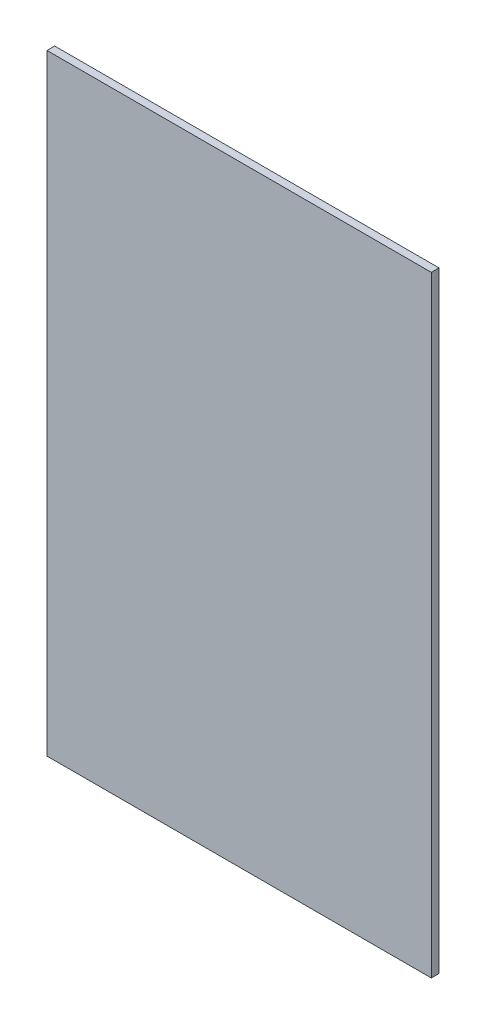
ISO-10303-21;
HEADER;
FILE_DESCRIPTION(('STEP AP214'),'2;1');
FILE_NAME('part.step','',(''),(''),'','','');
FILE_SCHEMA(('AUTOMOTIVE_DESIGN { 1 0 10303 214 1 1 1 1 }'));
ENDSEC;
DATA;
#1=APPLICATION_CONTEXT('core data for automotive mechanical design processes');
#2=APPLICATION_PROTOCOL_DEFINITION('international standard','automotive_design',2000,#1);
#3=PRODUCT_CONTEXT('',#1,'mechanical');
#4=PRODUCT('Part','Part','',(#3));
#5=PRODUCT_RELATED_PRODUCT_CATEGORY('part','',(#4));
#6=PRODUCT_DEFINITION_FORMATION('','',#4);
#7=PRODUCT_DEFINITION_CONTEXT('part definition',#1,'design');
#8=PRODUCT_DEFINITION('design','',#6,#7);
#9=PRODUCT_DEFINITION_SHAPE('','',#8);
#10=(LENGTH_UNIT() NAMED_UNIT(*) SI_UNIT(.MILLI.,.METRE.));
#11=(NAMED_UNIT(*) PLANE_ANGLE_UNIT() SI_UNIT($,.RADIAN.));
#12=(NAMED_UNIT(*) SI_UNIT($,.STERADIAN.) SOLID_ANGLE_UNIT());
#13=UNCERTAINTY_MEASURE_WITH_UNIT(LENGTH_MEASURE(1.E-05),#10,'distance_accuracy_value','');
#14=(GEOMETRIC_REPRESENTATION_CONTEXT(3) GLOBAL_UNCERTAINTY_ASSIGNED_CONTEXT((#13)) GLOBAL_UNIT_ASSIGNED_CONTEXT((#10,
#11,#12)) REPRESENTATION_CONTEXT('',''));
#15=CARTESIAN_POINT('',(0.,0.,0.));
#16=DIRECTION('',(0.,0.,1.));
#17=DIRECTION('',(1.,0.,0.));
#18=AXIS2_PLACEMENT_3D('',#15,#16,#17);
#19=CARTESIAN_POINT('',(50.,79.5,2.));
#20=DIRECTION('',(-1.,0.,0.));
#21=DIRECTION('',(0.,-1.,0.));
#22=AXIS2_PLACEMENT_3D('',#19,#20,#21);
#23=PLANE('',#22);
#24=DIRECTION('',(0.,1.,0.));
#25=VECTOR('',#24,1.);
#26=CARTESIAN_POINT('',(50.,79.5,0.));
#27=LINE('',#26,#25);
#28=CARTESIAN_POINT('',(50.,-79.5,0.));
#29=VERTEX_POINT('',#28);
#30=CARTESIAN_POINT('',(50.,79.5,0.));
#31=VERTEX_POINT('',#30);
#32=EDGE_CURVE('E95',#29,#31,#27,.T.);
#33=ORIENTED_EDGE('',*,*,#32,.T.);
#34=DIRECTION('',(0.,0.,-1.));
#35=VECTOR('',#34,1.);
#36=CARTESIAN_POINT('',(50.,79.5,2.));
#37=LINE('',#36,#35);
#38=CARTESIAN_POINT('',(50.,79.5,2.));
#39=VERTEX_POINT('',#38);
#40=EDGE_CURVE('E11',#39,#31,#37,.T.);
#41=ORIENTED_EDGE('',*,*,#40,.F.);
#42=DIRECTION('',(0.,1.,0.));
#43=VECTOR('',#42,1.);
#44=CARTESIAN_POINT('',(50.,79.5,2.));
#45=LINE('',#44,#43);
#46=CARTESIAN_POINT('',(50.,-79.5,2.));
#47=VERTEX_POINT('',#46);
#48=EDGE_CURVE('E83',#47,#39,#45,.T.);
#49=ORIENTED_EDGE('',*,*,#48,.F.);
#50=DIRECTION('',(0.,0.,-1.));
#51=VECTOR('',#50,1.);
#52=CARTESIAN_POINT('',(50.,-79.5,2.));
#53=LINE('',#52,#51);
#54=EDGE_CURVE('E91',#47,#29,#53,.T.);
#55=ORIENTED_EDGE('',*,*,#54,.T.);
#56=EDGE_LOOP('',(#33,#41,#49,#55));
#57=FACE_BOUND('',#56,.T.);
#58=ADVANCED_FACE('F32',(#57),#23,.F.);
#59=CARTESIAN_POINT('',(-50.,79.5,2.));
#60=DIRECTION('',(0.,-1.,0.));
#61=DIRECTION('',(0.,0.,-1.));
#62=AXIS2_PLACEMENT_3D('',#59,#60,#61);
#63=PLANE('',#62);
#64=DIRECTION('',(-1.,0.,0.));
#65=VECTOR('',#64,1.);
#66=CARTESIAN_POINT('',(-50.,79.5,0.));
#67=LINE('',#66,#65);
#68=CARTESIAN_POINT('',(-50.,79.5,0.));
#69=VERTEX_POINT('',#68);
#70=EDGE_CURVE('E87',#31,#69,#67,.T.);
#71=ORIENTED_EDGE('',*,*,#70,.T.);
#72=DIRECTION('',(0.,0.,-1.));
#73=VECTOR('',#72,1.);
#74=CARTESIAN_POINT('',(-50.,79.5,2.));
#75=LINE('',#74,#73);
#76=CARTESIAN_POINT('',(-50.,79.5,2.));
#77=VERTEX_POINT('',#76);
#78=EDGE_CURVE('E40',#77,#69,#75,.T.);
#79=ORIENTED_EDGE('',*,*,#78,.F.);
#80=DIRECTION('',(-1.,0.,0.));
#81=VECTOR('',#80,1.);
#82=CARTESIAN_POINT('',(-50.,79.5,2.));
#83=LINE('',#82,#81);
#84=EDGE_CURVE('E78',#39,#77,#83,.T.);
#85=ORIENTED_EDGE('',*,*,#84,.F.);
#86=ORIENTED_EDGE('',*,*,#40,.T.);
#87=EDGE_LOOP('',(#71,#79,#85,#86));
#88=FACE_BOUND('',#87,.T.);
#89=ADVANCED_FACE('F86',(#88),#63,.F.);
#90=CARTESIAN_POINT('',(-50.,79.5,2.));
#91=DIRECTION('',(1.,0.,0.));
#92=DIRECTION('',(0.,1.,0.));
#93=AXIS2_PLACEMENT_3D('',#90,#91,#92);
#94=PLANE('',#93);
#95=DIRECTION('',(0.,-1.,0.));
#96=VECTOR('',#95,1.);
#97=CARTESIAN_POINT('',(-50.,79.5,0.));
#98=LINE('',#97,#96);
#99=CARTESIAN_POINT('',(-50.,-79.5,0.));
#100=VERTEX_POINT('',#99);
#101=EDGE_CURVE('E65',#69,#100,#98,.T.);
#102=ORIENTED_EDGE('',*,*,#101,.T.);
#103=DIRECTION('',(0.,0.,-1.));
#104=VECTOR('',#103,1.);
#105=CARTESIAN_POINT('',(-50.,-79.5,2.));
#106=LINE('',#105,#104);
#107=CARTESIAN_POINT('',(-50.,-79.5,2.));
#108=VERTEX_POINT('',#107);
#109=EDGE_CURVE('E88',#108,#100,#106,.T.);
#110=ORIENTED_EDGE('',*,*,#109,.F.);
#111=DIRECTION('',(0.,-1.,0.));
#112=VECTOR('',#111,1.);
#113=CARTESIAN_POINT('',(-50.,79.5,2.));
#114=LINE('',#113,#112);
#115=EDGE_CURVE('E81',#77,#108,#114,.T.);
#116=ORIENTED_EDGE('',*,*,#115,.F.);
#117=ORIENTED_EDGE('',*,*,#78,.T.);
#118=EDGE_LOOP('',(#102,#110,#116,#117));
#119=FACE_BOUND('',#118,.T.);
#120=ADVANCED_FACE('F89',(#119),#94,.F.);
#121=CARTESIAN_POINT('',(-50.,-79.5,2.));
#122=DIRECTION('',(0.,1.,0.));
#123=DIRECTION('',(0.,0.,1.));
#124=AXIS2_PLACEMENT_3D('',#121,#122,#123);
#125=PLANE('',#124);
#126=DIRECTION('',(1.,0.,0.));
#127=VECTOR('',#126,1.);
#128=CARTESIAN_POINT('',(-50.,-79.5,0.));
#129=LINE('',#128,#127);
#130=EDGE_CURVE('E71',#100,#29,#129,.T.);
#131=ORIENTED_EDGE('',*,*,#130,.T.);
#132=ORIENTED_EDGE('',*,*,#54,.F.);
#133=DIRECTION('',(1.,0.,0.));
#134=VECTOR('',#133,1.);
#135=CARTESIAN_POINT('',(-50.,-79.5,2.));
#136=LINE('',#135,#134);
#137=EDGE_CURVE('E48',#108,#47,#136,.T.);
#138=ORIENTED_EDGE('',*,*,#137,.F.);
#139=ORIENTED_EDGE('',*,*,#109,.T.);
#140=EDGE_LOOP('',(#131,#132,#138,#139));
#141=FACE_BOUND('',#140,.T.);
#142=ADVANCED_FACE('F102',(#141),#125,.F.);
#143=CARTESIAN_POINT('',(0.,0.,2.));
#144=DIRECTION('',(0.,0.,1.));
#145=DIRECTION('',(1.,0.,0.));
#146=AXIS2_PLACEMENT_3D('',#143,#144,#145);
#147=PLANE('',#146);
#148=ORIENTED_EDGE('',*,*,#48,.T.);
#149=ORIENTED_EDGE('',*,*,#84,.T.);
#150=ORIENTED_EDGE('',*,*,#115,.T.);
#151=ORIENTED_EDGE('',*,*,#137,.T.);
#152=EDGE_LOOP('',(#148,#149,#150,#151));
#153=FACE_BOUND('',#152,.T.);
#154=ADVANCED_FACE('F79',(#153),#147,.T.);
#155=CARTESIAN_POINT('',(0.,0.,0.));
#156=DIRECTION('',(0.,0.,1.));
#157=DIRECTION('',(1.,0.,0.));
#158=AXIS2_PLACEMENT_3D('',#155,#156,#157);
#159=PLANE('',#158);
#160=ORIENTED_EDGE('',*,*,#32,.F.);
#161=ORIENTED_EDGE('',*,*,#130,.F.);
#162=ORIENTED_EDGE('',*,*,#101,.F.);
#163=ORIENTED_EDGE('',*,*,#70,.F.);
#164=EDGE_LOOP('',(#160,#161,#162,#163));
#165=FACE_BOUND('',#164,.T.);
#166=ADVANCED_FACE('F105',(#165),#159,.F.);
#167=CLOSED_SHELL('',(#58,#89,#120,#142,#154,#166));
#168=MANIFOLD_SOLID_BREP('B2',#167);
#169=ADVANCED_BREP_SHAPE_REPRESENTATION('',(#18,#168),#14);
#170=SHAPE_DEFINITION_REPRESENTATION(#9,#169);
ENDSEC;
END-ISO-10303-21;
